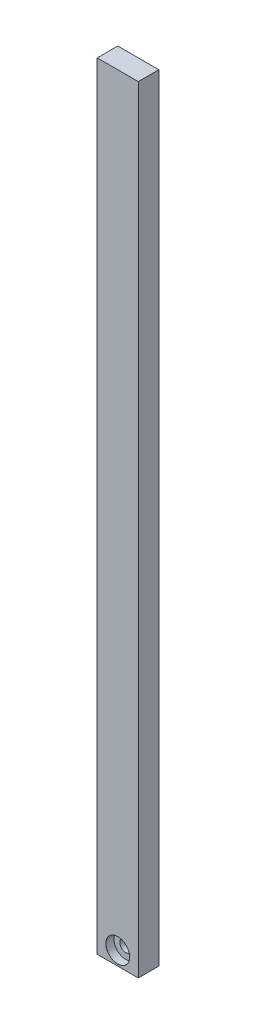
ISO-10303-21;
HEADER;
FILE_DESCRIPTION(('STEP AP214'),'2;1');
FILE_NAME('part.step','',(''),(''),'','','');
FILE_SCHEMA(('AUTOMOTIVE_DESIGN { 1 0 10303 214 1 1 1 1 }'));
ENDSEC;
DATA;
#1=APPLICATION_CONTEXT('core data for automotive mechanical design processes');
#2=APPLICATION_PROTOCOL_DEFINITION('international standard','automotive_design',2000,#1);
#3=PRODUCT_CONTEXT('',#1,'mechanical');
#4=PRODUCT('Part','Part','',(#3));
#5=PRODUCT_RELATED_PRODUCT_CATEGORY('part','',(#4));
#6=PRODUCT_DEFINITION_FORMATION('','',#4);
#7=PRODUCT_DEFINITION_CONTEXT('part definition',#1,'design');
#8=PRODUCT_DEFINITION('design','',#6,#7);
#9=PRODUCT_DEFINITION_SHAPE('','',#8);
#10=(LENGTH_UNIT() NAMED_UNIT(*) SI_UNIT(.MILLI.,.METRE.));
#11=(NAMED_UNIT(*) PLANE_ANGLE_UNIT() SI_UNIT($,.RADIAN.));
#12=(NAMED_UNIT(*) SI_UNIT($,.STERADIAN.) SOLID_ANGLE_UNIT());
#13=UNCERTAINTY_MEASURE_WITH_UNIT(LENGTH_MEASURE(1.E-05),#10,'distance_accuracy_value','');
#14=(GEOMETRIC_REPRESENTATION_CONTEXT(3) GLOBAL_UNCERTAINTY_ASSIGNED_CONTEXT((#13)) GLOBAL_UNIT_ASSIGNED_CONTEXT((#10,
#11,#12)) REPRESENTATION_CONTEXT('',''));
#15=CARTESIAN_POINT('',(0.,0.,0.));
#16=DIRECTION('',(0.,0.,1.));
#17=DIRECTION('',(1.,0.,0.));
#18=AXIS2_PLACEMENT_3D('',#15,#16,#17);
#19=CARTESIAN_POINT('',(0.,-173.65,9.525));
#20=DIRECTION('',(0.,0.,1.));
#21=DIRECTION('',(1.,0.,0.));
#22=AXIS2_PLACEMENT_3D('',#19,#20,#21);
#23=CYLINDRICAL_SURFACE('',#22,2.75);
#24=CARTESIAN_POINT('',(0.,-173.65,0.));
#25=DIRECTION('',(0.,0.,1.));
#26=DIRECTION('',(1.,0.,0.));
#27=AXIS2_PLACEMENT_3D('',#24,#25,#26);
#28=CIRCLE('',#27,2.75);
#29=CARTESIAN_POINT('',(2.75,-173.65,0.));
#30=VERTEX_POINT('',#29);
#31=EDGE_CURVE('E123',#30,#30,#28,.T.);
#32=ORIENTED_EDGE('',*,*,#31,.F.);
#33=EDGE_LOOP('',(#32));
#34=FACE_BOUND('',#33,.T.);
#35=CARTESIAN_POINT('',(0.,-173.65,5.825));
#36=DIRECTION('',(0.,0.,1.));
#37=DIRECTION('',(1.,0.,0.));
#38=AXIS2_PLACEMENT_3D('',#35,#36,#37);
#39=CIRCLE('',#38,2.75000000000001);
#40=CARTESIAN_POINT('',(2.75000000000001,-173.65,5.825));
#41=VERTEX_POINT('',#40);
#42=EDGE_CURVE('E143',#41,#41,#39,.T.);
#43=ORIENTED_EDGE('',*,*,#42,.T.);
#44=EDGE_LOOP('',(#43));
#45=FACE_BOUND('',#44,.T.);
#46=ADVANCED_FACE('F50',(#34,#45),#23,.F.);
#47=CARTESIAN_POINT('',(5.49999999999999,-173.65,5.825));
#48=DIRECTION('',(0.,0.,-1.));
#49=DIRECTION('',(-1.,0.,0.));
#50=AXIS2_PLACEMENT_3D('',#47,#48,#49);
#51=PLANE('',#50);
#52=ORIENTED_EDGE('',*,*,#42,.F.);
#53=EDGE_LOOP('',(#52));
#54=FACE_BOUND('',#53,.T.);
#55=CARTESIAN_POINT('',(0.,-173.65,5.825));
#56=DIRECTION('',(0.,0.,1.));
#57=DIRECTION('',(1.,0.,0.));
#58=AXIS2_PLACEMENT_3D('',#55,#56,#57);
#59=CIRCLE('',#58,5.49999999999999);
#60=CARTESIAN_POINT('',(5.49999999999999,-173.65,5.825));
#61=VERTEX_POINT('',#60);
#62=EDGE_CURVE('E147',#61,#61,#59,.T.);
#63=ORIENTED_EDGE('',*,*,#62,.T.);
#64=EDGE_LOOP('',(#63));
#65=FACE_BOUND('',#64,.T.);
#66=ADVANCED_FACE('F173',(#54,#65),#51,.F.);
#67=CARTESIAN_POINT('',(0.,-173.65,9.525));
#68=DIRECTION('',(0.,0.,1.));
#69=DIRECTION('',(1.,0.,0.));
#70=AXIS2_PLACEMENT_3D('',#67,#68,#69);
#71=CYLINDRICAL_SURFACE('',#70,5.49999999999999);
#72=ORIENTED_EDGE('',*,*,#62,.F.);
#73=EDGE_LOOP('',(#72));
#74=FACE_BOUND('',#73,.T.);
#75=CARTESIAN_POINT('',(0.,-173.65,9.49999999999999));
#76=DIRECTION('',(0.,0.,1.));
#77=DIRECTION('',(1.,0.,0.));
#78=AXIS2_PLACEMENT_3D('',#75,#76,#77);
#79=CIRCLE('',#78,5.49999999999999);
#80=CARTESIAN_POINT('',(5.49999999999999,-173.65,9.49999999999999));
#81=VERTEX_POINT('',#80);
#82=EDGE_CURVE('E151',#81,#81,#79,.T.);
#83=ORIENTED_EDGE('',*,*,#82,.T.);
#84=EDGE_LOOP('',(#83));
#85=FACE_BOUND('',#84,.T.);
#86=ADVANCED_FACE('F178',(#74,#85),#71,.F.);
#87=CARTESIAN_POINT('',(0.,-173.65,9.525));
#88=DIRECTION('',(0.,0.,1.));
#89=DIRECTION('',(1.,0.,0.));
#90=AXIS2_PLACEMENT_3D('',#87,#88,#89);
#91=CONICAL_SURFACE('',#90,5.525,0.785398163397379);
#92=ORIENTED_EDGE('',*,*,#82,.F.);
#93=EDGE_LOOP('',(#92));
#94=FACE_BOUND('',#93,.T.);
#95=CARTESIAN_POINT('',(0.,-173.65,9.525));
#96=DIRECTION('',(0.,0.,1.));
#97=DIRECTION('',(1.,0.,0.));
#98=AXIS2_PLACEMENT_3D('',#95,#96,#97);
#99=CIRCLE('',#98,5.525);
#100=CARTESIAN_POINT('',(5.525,-173.65,9.525));
#101=VERTEX_POINT('',#100);
#102=EDGE_CURVE('E155',#101,#101,#99,.T.);
#103=ORIENTED_EDGE('',*,*,#102,.T.);
#104=EDGE_LOOP('',(#103));
#105=FACE_BOUND('',#104,.T.);
#106=ADVANCED_FACE('F160',(#94,#105),#91,.F.);
#107=CARTESIAN_POINT('',(-9.52499999999999,-180.,9.525));
#108=DIRECTION('',(1.,0.,0.));
#109=DIRECTION('',(0.,0.,-1.));
#110=AXIS2_PLACEMENT_3D('',#107,#108,#109);
#111=PLANE('',#110);
#112=DIRECTION('',(0.,-1.,0.));
#113=VECTOR('',#112,1.);
#114=CARTESIAN_POINT('',(-9.52499999999999,-180.,0.));
#115=LINE('',#114,#113);
#116=CARTESIAN_POINT('',(-9.52499999999999,180.,0.));
#117=VERTEX_POINT('',#116);
#118=CARTESIAN_POINT('',(-9.52499999999999,-180.,0.));
#119=VERTEX_POINT('',#118);
#120=EDGE_CURVE('E119',#117,#119,#115,.T.);
#121=ORIENTED_EDGE('',*,*,#120,.T.);
#122=DIRECTION('',(0.,0.,-1.));
#123=VECTOR('',#122,1.);
#124=CARTESIAN_POINT('',(-9.52499999999999,-180.,9.525));
#125=LINE('',#124,#123);
#126=CARTESIAN_POINT('',(-9.52499999999999,-180.,9.525));
#127=VERTEX_POINT('',#126);
#128=EDGE_CURVE('E13',#127,#119,#125,.T.);
#129=ORIENTED_EDGE('',*,*,#128,.F.);
#130=DIRECTION('',(0.,-1.,0.));
#131=VECTOR('',#130,1.);
#132=CARTESIAN_POINT('',(-9.52499999999999,-180.,9.525));
#133=LINE('',#132,#131);
#134=CARTESIAN_POINT('',(-9.52499999999999,180.,9.525));
#135=VERTEX_POINT('',#134);
#136=EDGE_CURVE('E103',#135,#127,#133,.T.);
#137=ORIENTED_EDGE('',*,*,#136,.F.);
#138=DIRECTION('',(0.,0.,-1.));
#139=VECTOR('',#138,1.);
#140=CARTESIAN_POINT('',(-9.52499999999999,180.,9.525));
#141=LINE('',#140,#139);
#142=EDGE_CURVE('E115',#135,#117,#141,.T.);
#143=ORIENTED_EDGE('',*,*,#142,.T.);
#144=EDGE_LOOP('',(#121,#129,#137,#143));
#145=FACE_BOUND('',#144,.T.);
#146=ADVANCED_FACE('F52',(#145),#111,.F.);
#147=CARTESIAN_POINT('',(9.525,-180.,9.525));
#148=DIRECTION('',(0.,1.,0.));
#149=DIRECTION('',(0.,0.,1.));
#150=AXIS2_PLACEMENT_3D('',#147,#148,#149);
#151=PLANE('',#150);
#152=DIRECTION('',(1.,0.,0.));
#153=VECTOR('',#152,1.);
#154=CARTESIAN_POINT('',(9.525,-180.,0.));
#155=LINE('',#154,#153);
#156=CARTESIAN_POINT('',(9.525,-180.,0.));
#157=VERTEX_POINT('',#156);
#158=EDGE_CURVE('E108',#119,#157,#155,.T.);
#159=ORIENTED_EDGE('',*,*,#158,.T.);
#160=DIRECTION('',(0.,0.,-1.));
#161=VECTOR('',#160,1.);
#162=CARTESIAN_POINT('',(9.525,-180.,9.525));
#163=LINE('',#162,#161);
#164=CARTESIAN_POINT('',(9.525,-180.,9.525));
#165=VERTEX_POINT('',#164);
#166=EDGE_CURVE('E60',#165,#157,#163,.T.);
#167=ORIENTED_EDGE('',*,*,#166,.F.);
#168=DIRECTION('',(1.,0.,0.));
#169=VECTOR('',#168,1.);
#170=CARTESIAN_POINT('',(9.525,-180.,9.525));
#171=LINE('',#170,#169);
#172=EDGE_CURVE('E98',#127,#165,#171,.T.);
#173=ORIENTED_EDGE('',*,*,#172,.F.);
#174=ORIENTED_EDGE('',*,*,#128,.T.);
#175=EDGE_LOOP('',(#159,#167,#173,#174));
#176=FACE_BOUND('',#175,.T.);
#177=ADVANCED_FACE('F107',(#176),#151,.F.);
#178=CARTESIAN_POINT('',(9.525,-180.,9.525));
#179=DIRECTION('',(-1.,0.,0.));
#180=DIRECTION('',(0.,0.,1.));
#181=AXIS2_PLACEMENT_3D('',#178,#179,#180);
#182=PLANE('',#181);
#183=DIRECTION('',(0.,1.,0.));
#184=VECTOR('',#183,1.);
#185=CARTESIAN_POINT('',(9.525,-180.,0.));
#186=LINE('',#185,#184);
#187=CARTESIAN_POINT('',(9.525,180.,0.));
#188=VERTEX_POINT('',#187);
#189=EDGE_CURVE('E85',#157,#188,#186,.T.);
#190=ORIENTED_EDGE('',*,*,#189,.T.);
#191=DIRECTION('',(0.,0.,-1.));
#192=VECTOR('',#191,1.);
#193=CARTESIAN_POINT('',(9.525,180.,9.525));
#194=LINE('',#193,#192);
#195=CARTESIAN_POINT('',(9.525,180.,9.525));
#196=VERTEX_POINT('',#195);
#197=EDGE_CURVE('E110',#196,#188,#194,.T.);
#198=ORIENTED_EDGE('',*,*,#197,.F.);
#199=DIRECTION('',(0.,1.,0.));
#200=VECTOR('',#199,1.);
#201=CARTESIAN_POINT('',(9.525,-180.,9.525));
#202=LINE('',#201,#200);
#203=EDGE_CURVE('E101',#165,#196,#202,.T.);
#204=ORIENTED_EDGE('',*,*,#203,.F.);
#205=ORIENTED_EDGE('',*,*,#166,.T.);
#206=EDGE_LOOP('',(#190,#198,#204,#205));
#207=FACE_BOUND('',#206,.T.);
#208=ADVANCED_FACE('F111',(#207),#182,.F.);
#209=CARTESIAN_POINT('',(9.525,180.,9.525));
#210=DIRECTION('',(0.,-1.,0.));
#211=DIRECTION('',(0.,0.,-1.));
#212=AXIS2_PLACEMENT_3D('',#209,#210,#211);
#213=PLANE('',#212);
#214=DIRECTION('',(-1.,0.,0.));
#215=VECTOR('',#214,1.);
#216=CARTESIAN_POINT('',(9.525,180.,0.));
#217=LINE('',#216,#215);
#218=EDGE_CURVE('E91',#188,#117,#217,.T.);
#219=ORIENTED_EDGE('',*,*,#218,.T.);
#220=ORIENTED_EDGE('',*,*,#142,.F.);
#221=DIRECTION('',(-1.,0.,0.));
#222=VECTOR('',#221,1.);
#223=CARTESIAN_POINT('',(9.525,180.,9.525));
#224=LINE('',#223,#222);
#225=EDGE_CURVE('E68',#196,#135,#224,.T.);
#226=ORIENTED_EDGE('',*,*,#225,.F.);
#227=ORIENTED_EDGE('',*,*,#197,.T.);
#228=EDGE_LOOP('',(#219,#220,#226,#227));
#229=FACE_BOUND('',#228,.T.);
#230=ADVANCED_FACE('F133',(#229),#213,.F.);
#231=CARTESIAN_POINT('',(0.,0.,9.525));
#232=DIRECTION('',(0.,0.,1.));
#233=DIRECTION('',(1.,0.,0.));
#234=AXIS2_PLACEMENT_3D('',#231,#232,#233);
#235=PLANE('',#234);
#236=ORIENTED_EDGE('',*,*,#102,.F.);
#237=EDGE_LOOP('',(#236));
#238=FACE_BOUND('',#237,.T.);
#239=ORIENTED_EDGE('',*,*,#136,.T.);
#240=ORIENTED_EDGE('',*,*,#172,.T.);
#241=ORIENTED_EDGE('',*,*,#203,.T.);
#242=ORIENTED_EDGE('',*,*,#225,.T.);
#243=EDGE_LOOP('',(#239,#240,#241,#242));
#244=FACE_BOUND('',#243,.T.);
#245=ADVANCED_FACE('F99',(#238,#244),#235,.T.);
#246=CARTESIAN_POINT('',(0.,0.,0.));
#247=DIRECTION('',(0.,0.,1.));
#248=DIRECTION('',(1.,0.,0.));
#249=AXIS2_PLACEMENT_3D('',#246,#247,#248);
#250=PLANE('',#249);
#251=ORIENTED_EDGE('',*,*,#31,.T.);
#252=EDGE_LOOP('',(#251));
#253=FACE_BOUND('',#252,.T.);
#254=ORIENTED_EDGE('',*,*,#120,.F.);
#255=ORIENTED_EDGE('',*,*,#218,.F.);
#256=ORIENTED_EDGE('',*,*,#189,.F.);
#257=ORIENTED_EDGE('',*,*,#158,.F.);
#258=EDGE_LOOP('',(#254,#255,#256,#257));
#259=FACE_BOUND('',#258,.T.);
#260=ADVANCED_FACE('F136',(#253,#259),#250,.F.);
#261=CLOSED_SHELL('',(#46,#66,#86,#106,#146,#177,#208,#230,#245,#260));
#262=MANIFOLD_SOLID_BREP('B2',#261);
#263=ADVANCED_BREP_SHAPE_REPRESENTATION('',(#18,#262),#14);
#264=SHAPE_DEFINITION_REPRESENTATION(#9,#263);
ENDSEC;
END-ISO-10303-21;
